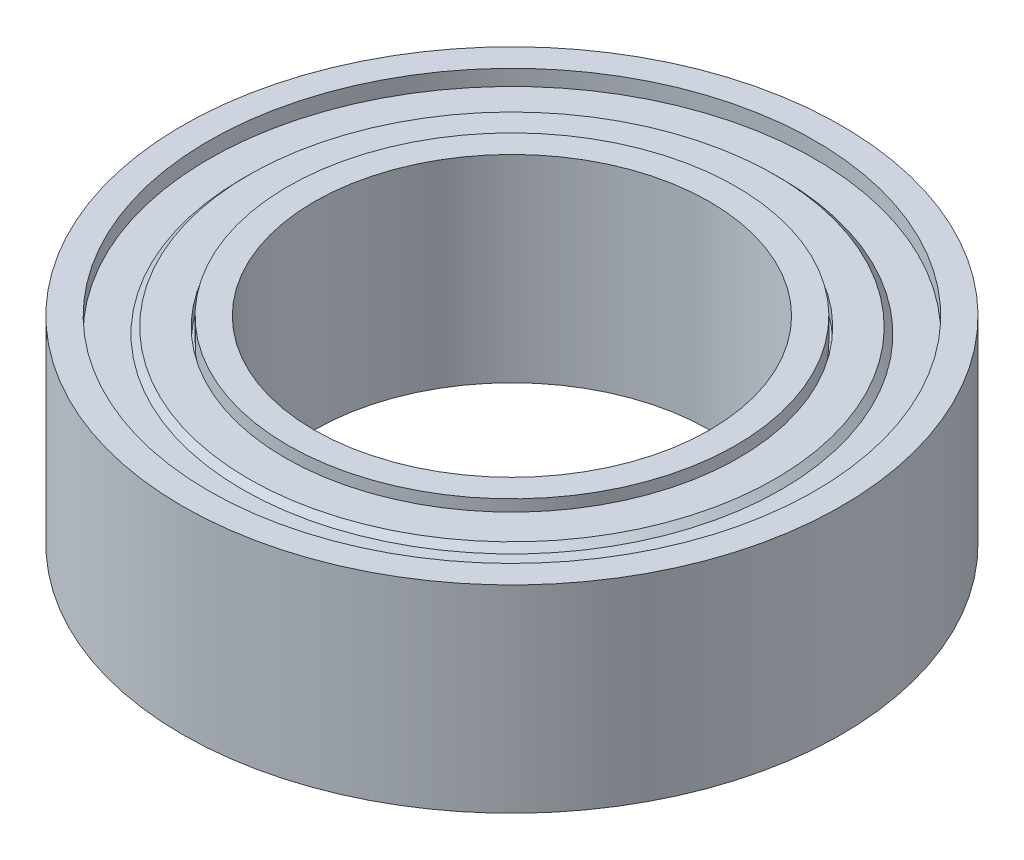
ISO-10303-21;
HEADER;
FILE_DESCRIPTION(('STEP AP214'),'2;1');
FILE_NAME('part.step','',(''),(''),'','','');
FILE_SCHEMA(('AUTOMOTIVE_DESIGN { 1 0 10303 214 1 1 1 1 }'));
ENDSEC;
DATA;
#1=APPLICATION_CONTEXT('core data for automotive mechanical design processes');
#2=APPLICATION_PROTOCOL_DEFINITION('international standard','automotive_design',2000,#1);
#3=PRODUCT_CONTEXT('',#1,'mechanical');
#4=PRODUCT('Part','Part','',(#3));
#5=PRODUCT_RELATED_PRODUCT_CATEGORY('part','',(#4));
#6=PRODUCT_DEFINITION_FORMATION('','',#4);
#7=PRODUCT_DEFINITION_CONTEXT('part definition',#1,'design');
#8=PRODUCT_DEFINITION('design','',#6,#7);
#9=PRODUCT_DEFINITION_SHAPE('','',#8);
#10=(LENGTH_UNIT() NAMED_UNIT(*) SI_UNIT(.MILLI.,.METRE.));
#11=(NAMED_UNIT(*) PLANE_ANGLE_UNIT() SI_UNIT($,.RADIAN.));
#12=(NAMED_UNIT(*) SI_UNIT($,.STERADIAN.) SOLID_ANGLE_UNIT());
#13=UNCERTAINTY_MEASURE_WITH_UNIT(LENGTH_MEASURE(1.E-05),#10,'distance_accuracy_value','');
#14=(GEOMETRIC_REPRESENTATION_CONTEXT(3) GLOBAL_UNCERTAINTY_ASSIGNED_CONTEXT((#13)) GLOBAL_UNIT_ASSIGNED_CONTEXT((#10,
#11,#12)) REPRESENTATION_CONTEXT('',''));
#15=CARTESIAN_POINT('',(0.,0.,0.));
#16=DIRECTION('',(0.,0.,1.));
#17=DIRECTION('',(1.,0.,0.));
#18=AXIS2_PLACEMENT_3D('',#15,#16,#17);
#19=CARTESIAN_POINT('',(0.,0.,0.));
#20=DIRECTION('',(0.,1.,0.));
#21=DIRECTION('',(0.,0.,1.));
#22=AXIS2_PLACEMENT_3D('',#19,#20,#21);
#23=CYLINDRICAL_SURFACE('',#22,5.);
#24=CARTESIAN_POINT('',(0.,-1.5,0.));
#25=DIRECTION('',(0.,1.,0.));
#26=DIRECTION('',(0.,0.,1.));
#27=AXIS2_PLACEMENT_3D('',#24,#25,#26);
#28=CIRCLE('',#27,5.);
#29=CARTESIAN_POINT('',(0.,-1.5,5.));
#30=VERTEX_POINT('',#29);
#31=EDGE_CURVE('E10',#30,#30,#28,.T.);
#32=ORIENTED_EDGE('',*,*,#31,.T.);
#33=EDGE_LOOP('',(#32));
#34=FACE_BOUND('',#33,.T.);
#35=CARTESIAN_POINT('',(0.,1.5,0.));
#36=DIRECTION('',(0.,1.,0.));
#37=DIRECTION('',(0.,0.,1.));
#38=AXIS2_PLACEMENT_3D('',#35,#36,#37);
#39=CIRCLE('',#38,5.);
#40=CARTESIAN_POINT('',(0.,1.5,5.));
#41=VERTEX_POINT('',#40);
#42=EDGE_CURVE('E74',#41,#41,#39,.T.);
#43=ORIENTED_EDGE('',*,*,#42,.F.);
#44=EDGE_LOOP('',(#43));
#45=FACE_BOUND('',#44,.T.);
#46=ADVANCED_FACE('F37',(#34,#45),#23,.T.);
#47=CARTESIAN_POINT('',(0.,-1.5,5.));
#48=DIRECTION('',(0.,-1.,0.));
#49=DIRECTION('',(0.,0.,-1.));
#50=AXIS2_PLACEMENT_3D('',#47,#48,#49);
#51=PLANE('',#50);
#52=CARTESIAN_POINT('',(0.,-1.5,0.));
#53=DIRECTION('',(0.,1.,0.));
#54=DIRECTION('',(0.,0.,1.));
#55=AXIS2_PLACEMENT_3D('',#52,#53,#54);
#56=CIRCLE('',#55,4.6);
#57=CARTESIAN_POINT('',(0.,-1.5,4.6));
#58=VERTEX_POINT('',#57);
#59=EDGE_CURVE('E43',#58,#58,#56,.T.);
#60=ORIENTED_EDGE('',*,*,#59,.T.);
#61=EDGE_LOOP('',(#60));
#62=FACE_BOUND('',#61,.T.);
#63=ORIENTED_EDGE('',*,*,#31,.F.);
#64=EDGE_LOOP('',(#63));
#65=FACE_BOUND('',#64,.T.);
#66=ADVANCED_FACE('F162',(#62,#65),#51,.T.);
#67=CARTESIAN_POINT('',(0.,0.,0.));
#68=DIRECTION('',(0.,1.,0.));
#69=DIRECTION('',(0.,0.,1.));
#70=AXIS2_PLACEMENT_3D('',#67,#68,#69);
#71=CYLINDRICAL_SURFACE('',#70,4.6);
#72=CARTESIAN_POINT('',(0.,-1.26142748572325,0.));
#73=DIRECTION('',(0.,1.,0.));
#74=DIRECTION('',(0.,0.,1.));
#75=AXIS2_PLACEMENT_3D('',#72,#73,#74);
#76=CIRCLE('',#75,4.6);
#77=CARTESIAN_POINT('',(0.,-1.26142748572325,4.6));
#78=VERTEX_POINT('',#77);
#79=EDGE_CURVE('E47',#78,#78,#76,.T.);
#80=ORIENTED_EDGE('',*,*,#79,.T.);
#81=EDGE_LOOP('',(#80));
#82=FACE_BOUND('',#81,.T.);
#83=ORIENTED_EDGE('',*,*,#59,.F.);
#84=EDGE_LOOP('',(#83));
#85=FACE_BOUND('',#84,.T.);
#86=ADVANCED_FACE('F168',(#82,#85),#71,.F.);
#87=CARTESIAN_POINT('',(0.,-1.26142748572325,4.6));
#88=DIRECTION('',(0.,-1.,0.));
#89=DIRECTION('',(0.,0.,-1.));
#90=AXIS2_PLACEMENT_3D('',#87,#88,#89);
#91=PLANE('',#90);
#92=CARTESIAN_POINT('',(0.,-1.26142748572325,0.));
#93=DIRECTION('',(0.,1.,0.));
#94=DIRECTION('',(0.,0.,1.));
#95=AXIS2_PLACEMENT_3D('',#92,#93,#94);
#96=CIRCLE('',#95,4.0868879157662);
#97=CARTESIAN_POINT('',(0.,-1.26142748572325,4.0868879157662));
#98=VERTEX_POINT('',#97);
#99=EDGE_CURVE('E51',#98,#98,#96,.T.);
#100=ORIENTED_EDGE('',*,*,#99,.T.);
#101=EDGE_LOOP('',(#100));
#102=FACE_BOUND('',#101,.T.);
#103=ORIENTED_EDGE('',*,*,#79,.F.);
#104=EDGE_LOOP('',(#103));
#105=FACE_BOUND('',#104,.T.);
#106=ADVANCED_FACE('F172',(#102,#105),#91,.T.);
#107=CARTESIAN_POINT('',(0.,-1.26142748572325,0.));
#108=DIRECTION('',(0.,1.,0.));
#109=DIRECTION('',(0.,0.,1.));
#110=AXIS2_PLACEMENT_3D('',#107,#108,#109);
#111=CONICAL_SURFACE('',#110,4.0868879157662,0.785398163397448);
#112=CARTESIAN_POINT('',(0.,-1.35467431095463,0.));
#113=DIRECTION('',(0.,1.,0.));
#114=DIRECTION('',(0.,0.,1.));
#115=AXIS2_PLACEMENT_3D('',#112,#113,#114);
#116=CIRCLE('',#115,3.99364109053482);
#117=CARTESIAN_POINT('',(0.,-1.35467431095463,3.99364109053482));
#118=VERTEX_POINT('',#117);
#119=EDGE_CURVE('E56',#118,#118,#116,.T.);
#120=ORIENTED_EDGE('',*,*,#119,.T.);
#121=EDGE_LOOP('',(#120));
#122=FACE_BOUND('',#121,.T.);
#123=ORIENTED_EDGE('',*,*,#99,.F.);
#124=EDGE_LOOP('',(#123));
#125=FACE_BOUND('',#124,.T.);
#126=ADVANCED_FACE('F179',(#122,#125),#111,.T.);
#127=CARTESIAN_POINT('',(0.,-1.35467431095463,3.99364109053482));
#128=DIRECTION('',(0.,-1.,0.));
#129=DIRECTION('',(0.,0.,-1.));
#130=AXIS2_PLACEMENT_3D('',#127,#128,#129);
#131=PLANE('',#130);
#132=CARTESIAN_POINT('',(0.,-1.35467431095463,0.));
#133=DIRECTION('',(0.,1.,0.));
#134=DIRECTION('',(0.,0.,1.));
#135=AXIS2_PLACEMENT_3D('',#132,#133,#134);
#136=CIRCLE('',#135,3.44144288362713);
#137=CARTESIAN_POINT('',(0.,-1.35467431095463,3.44144288362713));
#138=VERTEX_POINT('',#137);
#139=EDGE_CURVE('E59',#138,#138,#136,.T.);
#140=ORIENTED_EDGE('',*,*,#139,.T.);
#141=EDGE_LOOP('',(#140));
#142=FACE_BOUND('',#141,.T.);
#143=ORIENTED_EDGE('',*,*,#119,.F.);
#144=EDGE_LOOP('',(#143));
#145=FACE_BOUND('',#144,.T.);
#146=ADVANCED_FACE('F183',(#142,#145),#131,.T.);
#147=CARTESIAN_POINT('',(0.,0.,0.));
#148=DIRECTION('',(0.,1.,0.));
#149=DIRECTION('',(0.,0.,1.));
#150=AXIS2_PLACEMENT_3D('',#147,#148,#149);
#151=CYLINDRICAL_SURFACE('',#150,3.44144288362713);
#152=CARTESIAN_POINT('',(0.,-1.1388491722073,0.));
#153=DIRECTION('',(0.,1.,0.));
#154=DIRECTION('',(0.,0.,1.));
#155=AXIS2_PLACEMENT_3D('',#152,#153,#154);
#156=CIRCLE('',#155,3.44144288362713);
#157=CARTESIAN_POINT('',(0.,-1.1388491722073,3.44144288362713));
#158=VERTEX_POINT('',#157);
#159=EDGE_CURVE('E62',#158,#158,#156,.T.);
#160=ORIENTED_EDGE('',*,*,#159,.T.);
#161=EDGE_LOOP('',(#160));
#162=FACE_BOUND('',#161,.T.);
#163=ORIENTED_EDGE('',*,*,#139,.F.);
#164=EDGE_LOOP('',(#163));
#165=FACE_BOUND('',#164,.T.);
#166=ADVANCED_FACE('F187',(#162,#165),#151,.F.);
#167=CARTESIAN_POINT('',(0.,-1.1388491722073,3.44144288362713));
#168=DIRECTION('',(0.,-1.,0.));
#169=DIRECTION('',(0.,0.,-1.));
#170=AXIS2_PLACEMENT_3D('',#167,#168,#169);
#171=PLANE('',#170);
#172=CARTESIAN_POINT('',(0.,-1.1388491722073,0.));
#173=DIRECTION('',(0.,1.,0.));
#174=DIRECTION('',(0.,0.,1.));
#175=AXIS2_PLACEMENT_3D('',#172,#173,#174);
#176=CIRCLE('',#175,3.4);
#177=CARTESIAN_POINT('',(0.,-1.1388491722073,3.4));
#178=VERTEX_POINT('',#177);
#179=EDGE_CURVE('E65',#178,#178,#176,.T.);
#180=ORIENTED_EDGE('',*,*,#179,.T.);
#181=EDGE_LOOP('',(#180));
#182=FACE_BOUND('',#181,.T.);
#183=ORIENTED_EDGE('',*,*,#159,.F.);
#184=EDGE_LOOP('',(#183));
#185=FACE_BOUND('',#184,.T.);
#186=ADVANCED_FACE('F191',(#182,#185),#171,.T.);
#187=CARTESIAN_POINT('',(0.,0.,0.));
#188=DIRECTION('',(0.,1.,0.));
#189=DIRECTION('',(0.,0.,1.));
#190=AXIS2_PLACEMENT_3D('',#187,#188,#189);
#191=CYLINDRICAL_SURFACE('',#190,3.4);
#192=CARTESIAN_POINT('',(0.,-1.5,0.));
#193=DIRECTION('',(0.,1.,0.));
#194=DIRECTION('',(0.,0.,1.));
#195=AXIS2_PLACEMENT_3D('',#192,#193,#194);
#196=CIRCLE('',#195,3.4);
#197=CARTESIAN_POINT('',(0.,-1.5,3.4));
#198=VERTEX_POINT('',#197);
#199=EDGE_CURVE('E68',#198,#198,#196,.T.);
#200=ORIENTED_EDGE('',*,*,#199,.T.);
#201=EDGE_LOOP('',(#200));
#202=FACE_BOUND('',#201,.T.);
#203=ORIENTED_EDGE('',*,*,#179,.F.);
#204=EDGE_LOOP('',(#203));
#205=FACE_BOUND('',#204,.T.);
#206=ADVANCED_FACE('F195',(#202,#205),#191,.T.);
#207=CARTESIAN_POINT('',(0.,-1.5,3.4));
#208=DIRECTION('',(0.,-1.,0.));
#209=DIRECTION('',(0.,0.,-1.));
#210=AXIS2_PLACEMENT_3D('',#207,#208,#209);
#211=PLANE('',#210);
#212=CARTESIAN_POINT('',(0.,-1.5,0.));
#213=DIRECTION('',(0.,1.,0.));
#214=DIRECTION('',(0.,0.,1.));
#215=AXIS2_PLACEMENT_3D('',#212,#213,#214);
#216=CIRCLE('',#215,3.);
#217=CARTESIAN_POINT('',(0.,-1.5,3.));
#218=VERTEX_POINT('',#217);
#219=EDGE_CURVE('E71',#218,#218,#216,.T.);
#220=ORIENTED_EDGE('',*,*,#219,.T.);
#221=EDGE_LOOP('',(#220));
#222=FACE_BOUND('',#221,.T.);
#223=ORIENTED_EDGE('',*,*,#199,.F.);
#224=EDGE_LOOP('',(#223));
#225=FACE_BOUND('',#224,.T.);
#226=ADVANCED_FACE('F199',(#222,#225),#211,.T.);
#227=CARTESIAN_POINT('',(0.,0.,0.));
#228=DIRECTION('',(0.,1.,0.));
#229=DIRECTION('',(0.,0.,1.));
#230=AXIS2_PLACEMENT_3D('',#227,#228,#229);
#231=CYLINDRICAL_SURFACE('',#230,3.);
#232=ORIENTED_EDGE('',*,*,#219,.F.);
#233=EDGE_LOOP('',(#232));
#234=FACE_BOUND('',#233,.T.);
#235=CARTESIAN_POINT('',(0.,1.5,0.));
#236=DIRECTION('',(0.,1.,0.));
#237=DIRECTION('',(0.,0.,1.));
#238=AXIS2_PLACEMENT_3D('',#235,#236,#237);
#239=CIRCLE('',#238,3.);
#240=CARTESIAN_POINT('',(0.,1.5,3.));
#241=VERTEX_POINT('',#240);
#242=EDGE_CURVE('E101',#241,#241,#239,.T.);
#243=ORIENTED_EDGE('',*,*,#242,.T.);
#244=EDGE_LOOP('',(#243));
#245=FACE_BOUND('',#244,.T.);
#246=ADVANCED_FACE('F105',(#234,#245),#231,.F.);
#247=CARTESIAN_POINT('',(0.,1.5,5.));
#248=DIRECTION('',(0.,1.,0.));
#249=DIRECTION('',(0.,0.,-1.));
#250=AXIS2_PLACEMENT_3D('',#247,#248,#249);
#251=PLANE('',#250);
#252=CARTESIAN_POINT('',(0.,1.5,0.));
#253=DIRECTION('',(0.,1.,0.));
#254=DIRECTION('',(0.,0.,1.));
#255=AXIS2_PLACEMENT_3D('',#252,#253,#254);
#256=CIRCLE('',#255,4.6);
#257=CARTESIAN_POINT('',(0.,1.5,4.6));
#258=VERTEX_POINT('',#257);
#259=EDGE_CURVE('E77',#258,#258,#256,.T.);
#260=ORIENTED_EDGE('',*,*,#259,.F.);
#261=EDGE_LOOP('',(#260));
#262=FACE_BOUND('',#261,.T.);
#263=ORIENTED_EDGE('',*,*,#42,.T.);
#264=EDGE_LOOP('',(#263));
#265=FACE_BOUND('',#264,.T.);
#266=ADVANCED_FACE('F152',(#262,#265),#251,.T.);
#267=CARTESIAN_POINT('',(0.,0.,0.));
#268=DIRECTION('',(0.,-1.,0.));
#269=DIRECTION('',(0.,0.,1.));
#270=AXIS2_PLACEMENT_3D('',#267,#268,#269);
#271=CYLINDRICAL_SURFACE('',#270,4.6);
#272=CARTESIAN_POINT('',(0.,1.26142748572325,0.));
#273=DIRECTION('',(0.,1.,0.));
#274=DIRECTION('',(0.,0.,1.));
#275=AXIS2_PLACEMENT_3D('',#272,#273,#274);
#276=CIRCLE('',#275,4.6);
#277=CARTESIAN_POINT('',(0.,1.26142748572325,4.6));
#278=VERTEX_POINT('',#277);
#279=EDGE_CURVE('E80',#278,#278,#276,.T.);
#280=ORIENTED_EDGE('',*,*,#279,.F.);
#281=EDGE_LOOP('',(#280));
#282=FACE_BOUND('',#281,.T.);
#283=ORIENTED_EDGE('',*,*,#259,.T.);
#284=EDGE_LOOP('',(#283));
#285=FACE_BOUND('',#284,.T.);
#286=ADVANCED_FACE('F146',(#282,#285),#271,.F.);
#287=CARTESIAN_POINT('',(0.,1.26142748572325,4.6));
#288=DIRECTION('',(0.,1.,0.));
#289=DIRECTION('',(0.,0.,-1.));
#290=AXIS2_PLACEMENT_3D('',#287,#288,#289);
#291=PLANE('',#290);
#292=CARTESIAN_POINT('',(0.,1.26142748572325,0.));
#293=DIRECTION('',(0.,1.,0.));
#294=DIRECTION('',(0.,0.,1.));
#295=AXIS2_PLACEMENT_3D('',#292,#293,#294);
#296=CIRCLE('',#295,4.0868879157662);
#297=CARTESIAN_POINT('',(0.,1.26142748572325,4.0868879157662));
#298=VERTEX_POINT('',#297);
#299=EDGE_CURVE('E83',#298,#298,#296,.T.);
#300=ORIENTED_EDGE('',*,*,#299,.F.);
#301=EDGE_LOOP('',(#300));
#302=FACE_BOUND('',#301,.T.);
#303=ORIENTED_EDGE('',*,*,#279,.T.);
#304=EDGE_LOOP('',(#303));
#305=FACE_BOUND('',#304,.T.);
#306=ADVANCED_FACE('F140',(#302,#305),#291,.T.);
#307=CARTESIAN_POINT('',(0.,1.26142748572325,0.));
#308=DIRECTION('',(0.,-1.,0.));
#309=DIRECTION('',(0.,0.,1.));
#310=AXIS2_PLACEMENT_3D('',#307,#308,#309);
#311=CONICAL_SURFACE('',#310,4.0868879157662,0.785398163397448);
#312=CARTESIAN_POINT('',(0.,1.35467431095463,0.));
#313=DIRECTION('',(0.,1.,0.));
#314=DIRECTION('',(0.,0.,1.));
#315=AXIS2_PLACEMENT_3D('',#312,#313,#314);
#316=CIRCLE('',#315,3.99364109053482);
#317=CARTESIAN_POINT('',(0.,1.35467431095463,3.99364109053482));
#318=VERTEX_POINT('',#317);
#319=EDGE_CURVE('E86',#318,#318,#316,.T.);
#320=ORIENTED_EDGE('',*,*,#319,.F.);
#321=EDGE_LOOP('',(#320));
#322=FACE_BOUND('',#321,.T.);
#323=ORIENTED_EDGE('',*,*,#299,.T.);
#324=EDGE_LOOP('',(#323));
#325=FACE_BOUND('',#324,.T.);
#326=ADVANCED_FACE('F134',(#322,#325),#311,.T.);
#327=CARTESIAN_POINT('',(0.,1.35467431095463,3.99364109053482));
#328=DIRECTION('',(0.,1.,0.));
#329=DIRECTION('',(0.,0.,-1.));
#330=AXIS2_PLACEMENT_3D('',#327,#328,#329);
#331=PLANE('',#330);
#332=CARTESIAN_POINT('',(0.,1.35467431095463,0.));
#333=DIRECTION('',(0.,1.,0.));
#334=DIRECTION('',(0.,0.,1.));
#335=AXIS2_PLACEMENT_3D('',#332,#333,#334);
#336=CIRCLE('',#335,3.44144288362713);
#337=CARTESIAN_POINT('',(0.,1.35467431095463,3.44144288362713));
#338=VERTEX_POINT('',#337);
#339=EDGE_CURVE('E89',#338,#338,#336,.T.);
#340=ORIENTED_EDGE('',*,*,#339,.F.);
#341=EDGE_LOOP('',(#340));
#342=FACE_BOUND('',#341,.T.);
#343=ORIENTED_EDGE('',*,*,#319,.T.);
#344=EDGE_LOOP('',(#343));
#345=FACE_BOUND('',#344,.T.);
#346=ADVANCED_FACE('F128',(#342,#345),#331,.T.);
#347=CARTESIAN_POINT('',(0.,0.,0.));
#348=DIRECTION('',(0.,-1.,0.));
#349=DIRECTION('',(0.,0.,1.));
#350=AXIS2_PLACEMENT_3D('',#347,#348,#349);
#351=CYLINDRICAL_SURFACE('',#350,3.44144288362713);
#352=CARTESIAN_POINT('',(0.,1.1388491722073,0.));
#353=DIRECTION('',(0.,1.,0.));
#354=DIRECTION('',(0.,0.,1.));
#355=AXIS2_PLACEMENT_3D('',#352,#353,#354);
#356=CIRCLE('',#355,3.44144288362713);
#357=CARTESIAN_POINT('',(0.,1.1388491722073,3.44144288362713));
#358=VERTEX_POINT('',#357);
#359=EDGE_CURVE('E92',#358,#358,#356,.T.);
#360=ORIENTED_EDGE('',*,*,#359,.F.);
#361=EDGE_LOOP('',(#360));
#362=FACE_BOUND('',#361,.T.);
#363=ORIENTED_EDGE('',*,*,#339,.T.);
#364=EDGE_LOOP('',(#363));
#365=FACE_BOUND('',#364,.T.);
#366=ADVANCED_FACE('F122',(#362,#365),#351,.F.);
#367=CARTESIAN_POINT('',(0.,1.1388491722073,3.44144288362713));
#368=DIRECTION('',(0.,1.,0.));
#369=DIRECTION('',(0.,0.,-1.));
#370=AXIS2_PLACEMENT_3D('',#367,#368,#369);
#371=PLANE('',#370);
#372=CARTESIAN_POINT('',(0.,1.1388491722073,0.));
#373=DIRECTION('',(0.,1.,0.));
#374=DIRECTION('',(0.,0.,1.));
#375=AXIS2_PLACEMENT_3D('',#372,#373,#374);
#376=CIRCLE('',#375,3.4);
#377=CARTESIAN_POINT('',(0.,1.1388491722073,3.4));
#378=VERTEX_POINT('',#377);
#379=EDGE_CURVE('E95',#378,#378,#376,.T.);
#380=ORIENTED_EDGE('',*,*,#379,.F.);
#381=EDGE_LOOP('',(#380));
#382=FACE_BOUND('',#381,.T.);
#383=ORIENTED_EDGE('',*,*,#359,.T.);
#384=EDGE_LOOP('',(#383));
#385=FACE_BOUND('',#384,.T.);
#386=ADVANCED_FACE('F116',(#382,#385),#371,.T.);
#387=CARTESIAN_POINT('',(0.,0.,0.));
#388=DIRECTION('',(0.,-1.,0.));
#389=DIRECTION('',(0.,0.,1.));
#390=AXIS2_PLACEMENT_3D('',#387,#388,#389);
#391=CYLINDRICAL_SURFACE('',#390,3.4);
#392=CARTESIAN_POINT('',(0.,1.5,0.));
#393=DIRECTION('',(0.,1.,0.));
#394=DIRECTION('',(0.,0.,1.));
#395=AXIS2_PLACEMENT_3D('',#392,#393,#394);
#396=CIRCLE('',#395,3.4);
#397=CARTESIAN_POINT('',(0.,1.5,3.4));
#398=VERTEX_POINT('',#397);
#399=EDGE_CURVE('E98',#398,#398,#396,.T.);
#400=ORIENTED_EDGE('',*,*,#399,.F.);
#401=EDGE_LOOP('',(#400));
#402=FACE_BOUND('',#401,.T.);
#403=ORIENTED_EDGE('',*,*,#379,.T.);
#404=EDGE_LOOP('',(#403));
#405=FACE_BOUND('',#404,.T.);
#406=ADVANCED_FACE('F110',(#402,#405),#391,.T.);
#407=CARTESIAN_POINT('',(0.,1.5,3.4));
#408=DIRECTION('',(0.,1.,0.));
#409=DIRECTION('',(0.,0.,-1.));
#410=AXIS2_PLACEMENT_3D('',#407,#408,#409);
#411=PLANE('',#410);
#412=ORIENTED_EDGE('',*,*,#242,.F.);
#413=EDGE_LOOP('',(#412));
#414=FACE_BOUND('',#413,.T.);
#415=ORIENTED_EDGE('',*,*,#399,.T.);
#416=EDGE_LOOP('',(#415));
#417=FACE_BOUND('',#416,.T.);
#418=ADVANCED_FACE('F107',(#414,#417),#411,.T.);
#419=CLOSED_SHELL('',(#46,#66,#86,#106,#126,#146,#166,#186,#206,#226,#246,#266,#286,#306,#326,
#346,#366,#386,#406,#418));
#420=MANIFOLD_SOLID_BREP('B2',#419);
#421=ADVANCED_BREP_SHAPE_REPRESENTATION('',(#18,#420),#14);
#422=SHAPE_DEFINITION_REPRESENTATION(#9,#421);
ENDSEC;
END-ISO-10303-21;
